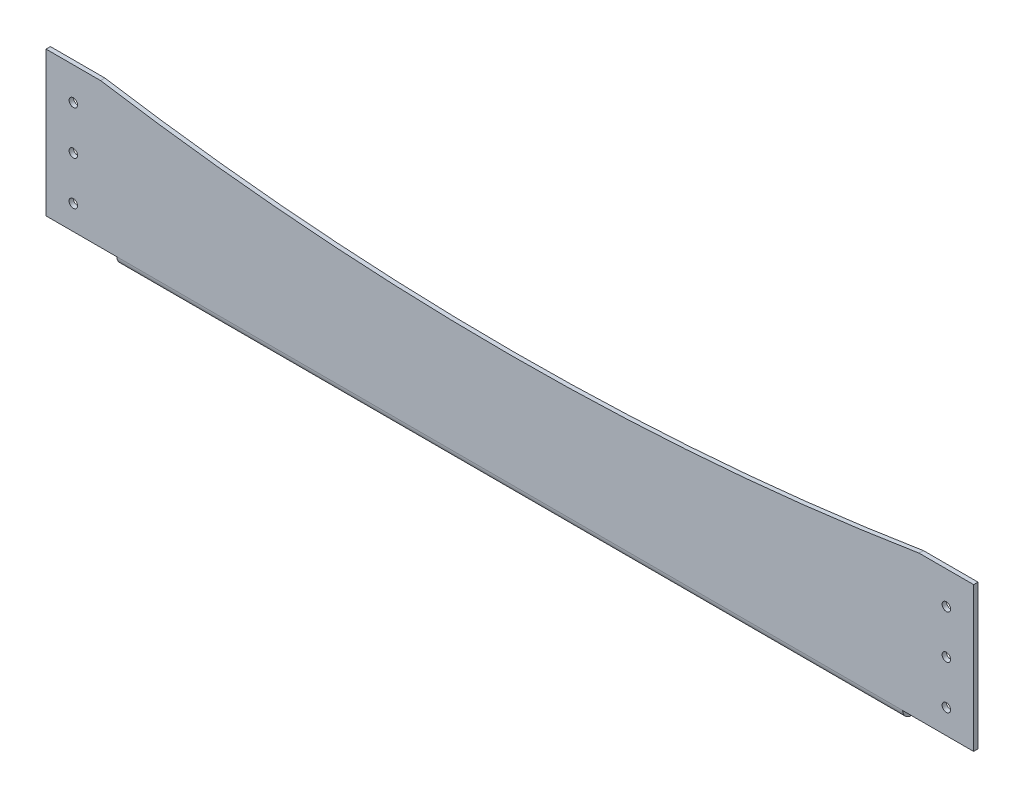
ISO-10303-21;
HEADER;
FILE_DESCRIPTION(('STEP AP214'),'2;1');
FILE_NAME('part.step','',(''),(''),'','','');
FILE_SCHEMA(('AUTOMOTIVE_DESIGN { 1 0 10303 214 1 1 1 1 }'));
ENDSEC;
DATA;
#1=APPLICATION_CONTEXT('core data for automotive mechanical design processes');
#2=APPLICATION_PROTOCOL_DEFINITION('international standard','automotive_design',2000,#1);
#3=PRODUCT_CONTEXT('',#1,'mechanical');
#4=PRODUCT('Part','Part','',(#3));
#5=PRODUCT_RELATED_PRODUCT_CATEGORY('part','',(#4));
#6=PRODUCT_DEFINITION_FORMATION('','',#4);
#7=PRODUCT_DEFINITION_CONTEXT('part definition',#1,'design');
#8=PRODUCT_DEFINITION('design','',#6,#7);
#9=PRODUCT_DEFINITION_SHAPE('','',#8);
#10=(LENGTH_UNIT() NAMED_UNIT(*) SI_UNIT(.MILLI.,.METRE.));
#11=(NAMED_UNIT(*) PLANE_ANGLE_UNIT() SI_UNIT($,.RADIAN.));
#12=(NAMED_UNIT(*) SI_UNIT($,.STERADIAN.) SOLID_ANGLE_UNIT());
#13=UNCERTAINTY_MEASURE_WITH_UNIT(LENGTH_MEASURE(1.E-05),#10,'distance_accuracy_value','');
#14=(GEOMETRIC_REPRESENTATION_CONTEXT(3) GLOBAL_UNCERTAINTY_ASSIGNED_CONTEXT((#13)) GLOBAL_UNIT_ASSIGNED_CONTEXT((#10,
#11,#12)) REPRESENTATION_CONTEXT('',''));
#15=CARTESIAN_POINT('',(0.,0.,0.));
#16=DIRECTION('',(0.,0.,1.));
#17=DIRECTION('',(1.,0.,0.));
#18=AXIS2_PLACEMENT_3D('',#15,#16,#17);
#19=CARTESIAN_POINT('',(269.874999999994,63.5,2.54));
#20=DIRECTION('',(0.,1.,0.));
#21=DIRECTION('',(-1.,0.,0.));
#22=AXIS2_PLACEMENT_3D('',#19,#20,#21);
#23=PLANE('',#22);
#24=DIRECTION('',(-1.,0.,0.));
#25=VECTOR('',#24,1.);
#26=CARTESIAN_POINT('',(269.874999999994,63.5,2.54));
#27=LINE('',#26,#25);
#28=CARTESIAN_POINT('',(-238.125000000007,63.4999999999999,2.54));
#29=VERTEX_POINT('',#28);
#30=CARTESIAN_POINT('',(-269.874999999993,63.5,2.54));
#31=VERTEX_POINT('',#30);
#32=EDGE_CURVE('E173',#29,#31,#27,.T.);
#33=ORIENTED_EDGE('',*,*,#32,.F.);
#34=DIRECTION('',(0.,0.,-1.));
#35=VECTOR('',#34,1.);
#36=CARTESIAN_POINT('',(-238.125000000007,63.4999999999999,0.));
#37=LINE('',#36,#35);
#38=CARTESIAN_POINT('',(-238.125000000007,63.4999999999999,0.));
#39=VERTEX_POINT('',#38);
#40=EDGE_CURVE('E153',#39,#29,#37,.F.);
#41=ORIENTED_EDGE('',*,*,#40,.F.);
#42=DIRECTION('',(1.,0.,0.));
#43=VECTOR('',#42,1.);
#44=CARTESIAN_POINT('',(0.,63.5,0.));
#45=LINE('',#44,#43);
#46=CARTESIAN_POINT('',(-269.874999999993,63.5,0.));
#47=VERTEX_POINT('',#46);
#48=EDGE_CURVE('E188',#39,#47,#45,.F.);
#49=ORIENTED_EDGE('',*,*,#48,.T.);
#50=DIRECTION('',(0.,0.,1.));
#51=VECTOR('',#50,1.);
#52=CARTESIAN_POINT('',(-269.874999999993,63.5,2.54));
#53=LINE('',#52,#51);
#54=EDGE_CURVE('E175',#47,#31,#53,.T.);
#55=ORIENTED_EDGE('',*,*,#54,.T.);
#56=EDGE_LOOP('',(#33,#41,#49,#55));
#57=FACE_BOUND('',#56,.T.);
#58=ADVANCED_FACE('F61',(#57),#23,.T.);
#59=CARTESIAN_POINT('',(269.874999999994,63.5,0.));
#60=VERTEX_POINT('',#59);
#61=CARTESIAN_POINT('',(238.125000000007,63.5,0.));
#62=VERTEX_POINT('',#61);
#63=EDGE_CURVE('E165',#60,#62,#45,.F.);
#64=ORIENTED_EDGE('',*,*,#63,.T.);
#65=DIRECTION('',(0.,0.,-1.));
#66=VECTOR('',#65,1.);
#67=CARTESIAN_POINT('',(238.125000000006,63.5,0.));
#68=LINE('',#67,#66);
#69=CARTESIAN_POINT('',(238.125000000007,63.4999999999999,2.54));
#70=VERTEX_POINT('',#69);
#71=EDGE_CURVE('E78',#62,#70,#68,.F.);
#72=ORIENTED_EDGE('',*,*,#71,.T.);
#73=CARTESIAN_POINT('',(269.874999999994,63.5,2.54));
#74=VERTEX_POINT('',#73);
#75=EDGE_CURVE('E163',#74,#70,#27,.T.);
#76=ORIENTED_EDGE('',*,*,#75,.F.);
#77=DIRECTION('',(0.,0.,1.));
#78=VECTOR('',#77,1.);
#79=CARTESIAN_POINT('',(269.874999999994,63.5,2.54));
#80=LINE('',#79,#78);
#81=EDGE_CURVE('E70',#60,#74,#80,.T.);
#82=ORIENTED_EDGE('',*,*,#81,.F.);
#83=EDGE_LOOP('',(#64,#72,#76,#82));
#84=FACE_BOUND('',#83,.T.);
#85=ADVANCED_FACE('F162',(#84),#23,.T.);
#86=CARTESIAN_POINT('',(0.,0.,2.54));
#87=DIRECTION('',(0.,0.,1.));
#88=DIRECTION('',(1.,0.,0.));
#89=AXIS2_PLACEMENT_3D('',#86,#87,#88);
#90=PLANE('',#89);
#91=CARTESIAN_POINT('',(-254.000000000006,44.4499999999999,2.54));
#92=DIRECTION('',(0.,0.,1.));
#93=DIRECTION('',(1.,0.,0.));
#94=AXIS2_PLACEMENT_3D('',#91,#92,#93);
#95=CIRCLE('',#94,2.45744999999997);
#96=CARTESIAN_POINT('',(-251.542550000006,44.4499999999999,2.54));
#97=VERTEX_POINT('',#96);
#98=EDGE_CURVE('E221',#97,#97,#95,.T.);
#99=ORIENTED_EDGE('',*,*,#98,.F.);
#100=EDGE_LOOP('',(#99));
#101=FACE_BOUND('',#100,.T.);
#102=CARTESIAN_POINT('',(-254.000000000006,19.0499999999999,2.54));
#103=DIRECTION('',(0.,0.,1.));
#104=DIRECTION('',(1.,0.,0.));
#105=AXIS2_PLACEMENT_3D('',#102,#103,#104);
#106=CIRCLE('',#105,2.45744999999997);
#107=CARTESIAN_POINT('',(-251.542550000006,19.0499999999999,2.54));
#108=VERTEX_POINT('',#107);
#109=EDGE_CURVE('E210',#108,#108,#106,.T.);
#110=ORIENTED_EDGE('',*,*,#109,.F.);
#111=EDGE_LOOP('',(#110));
#112=FACE_BOUND('',#111,.T.);
#113=CARTESIAN_POINT('',(-254.000000000006,-6.35000000000008,2.54));
#114=DIRECTION('',(0.,0.,1.));
#115=DIRECTION('',(1.,0.,0.));
#116=AXIS2_PLACEMENT_3D('',#113,#114,#115);
#117=CIRCLE('',#116,2.45744999999997);
#118=CARTESIAN_POINT('',(-251.542550000006,-6.35000000000008,2.54));
#119=VERTEX_POINT('',#118);
#120=EDGE_CURVE('E209',#119,#119,#117,.T.);
#121=ORIENTED_EDGE('',*,*,#120,.F.);
#122=EDGE_LOOP('',(#121));
#123=FACE_BOUND('',#122,.T.);
#124=CARTESIAN_POINT('',(253.999999999994,-6.35000000000008,2.54));
#125=DIRECTION('',(0.,0.,1.));
#126=DIRECTION('',(1.,0.,0.));
#127=AXIS2_PLACEMENT_3D('',#124,#125,#126);
#128=CIRCLE('',#127,2.45744999999997);
#129=CARTESIAN_POINT('',(256.457449999994,-6.35000000000008,2.54));
#130=VERTEX_POINT('',#129);
#131=EDGE_CURVE('E206',#130,#130,#128,.T.);
#132=ORIENTED_EDGE('',*,*,#131,.F.);
#133=EDGE_LOOP('',(#132));
#134=FACE_BOUND('',#133,.T.);
#135=CARTESIAN_POINT('',(253.999999999994,19.0499999999999,2.54));
#136=DIRECTION('',(0.,0.,1.));
#137=DIRECTION('',(1.,0.,0.));
#138=AXIS2_PLACEMENT_3D('',#135,#136,#137);
#139=CIRCLE('',#138,2.45744999999997);
#140=CARTESIAN_POINT('',(256.457449999994,19.0499999999999,2.54));
#141=VERTEX_POINT('',#140);
#142=EDGE_CURVE('E203',#141,#141,#139,.T.);
#143=ORIENTED_EDGE('',*,*,#142,.F.);
#144=EDGE_LOOP('',(#143));
#145=FACE_BOUND('',#144,.T.);
#146=CARTESIAN_POINT('',(253.999999999994,44.4499999999999,2.54));
#147=DIRECTION('',(0.,0.,1.));
#148=DIRECTION('',(1.,0.,0.));
#149=AXIS2_PLACEMENT_3D('',#146,#147,#148);
#150=CIRCLE('',#149,2.45744999999997);
#151=CARTESIAN_POINT('',(256.457449999994,44.4499999999999,2.54));
#152=VERTEX_POINT('',#151);
#153=EDGE_CURVE('E202',#152,#152,#150,.T.);
#154=ORIENTED_EDGE('',*,*,#153,.F.);
#155=EDGE_LOOP('',(#154));
#156=FACE_BOUND('',#155,.T.);
#157=ORIENTED_EDGE('',*,*,#75,.T.);
#158=CARTESIAN_POINT('',(0.,1542.25625000008,2.54));
#159=DIRECTION('',(0.,0.,1.));
#160=DIRECTION('',(1.,0.,0.));
#161=AXIS2_PLACEMENT_3D('',#158,#159,#160);
#162=CIRCLE('',#161,1497.80625000008);
#163=EDGE_CURVE('E150',#29,#70,#162,.T.);
#164=ORIENTED_EDGE('',*,*,#163,.F.);
#165=ORIENTED_EDGE('',*,*,#32,.T.);
#166=DIRECTION('',(0.,-1.,0.));
#167=VECTOR('',#166,1.);
#168=CARTESIAN_POINT('',(-269.874999999994,-20.5695654790461,2.54));
#169=LINE('',#168,#167);
#170=CARTESIAN_POINT('',(-269.874999999994,-20.5695654790461,2.54));
#171=VERTEX_POINT('',#170);
#172=EDGE_CURVE('E187',#31,#171,#169,.T.);
#173=ORIENTED_EDGE('',*,*,#172,.T.);
#174=DIRECTION('',(1.,0.,0.));
#175=VECTOR('',#174,1.);
#176=CARTESIAN_POINT('',(269.874999999994,-20.5695654790461,2.54));
#177=LINE('',#176,#175);
#178=CARTESIAN_POINT('',(-228.6,-20.5695654790461,2.54));
#179=VERTEX_POINT('',#178);
#180=EDGE_CURVE('E288',#171,#179,#177,.T.);
#181=ORIENTED_EDGE('',*,*,#180,.T.);
#182=DIRECTION('',(-1.,0.,0.));
#183=VECTOR('',#182,1.);
#184=CARTESIAN_POINT('',(-228.6,-20.5695654790461,2.54000000000006));
#185=LINE('',#184,#183);
#186=CARTESIAN_POINT('',(228.6,-20.5695654790461,2.5400000000001));
#187=VERTEX_POINT('',#186);
#188=EDGE_CURVE('E267',#179,#187,#185,.F.);
#189=ORIENTED_EDGE('',*,*,#188,.T.);
#190=CARTESIAN_POINT('',(269.874999999994,-20.5695654790461,2.54));
#191=VERTEX_POINT('',#190);
#192=EDGE_CURVE('E287',#187,#191,#177,.T.);
#193=ORIENTED_EDGE('',*,*,#192,.T.);
#194=DIRECTION('',(0.,1.,0.));
#195=VECTOR('',#194,1.);
#196=CARTESIAN_POINT('',(269.874999999994,-20.5695654790461,2.54));
#197=LINE('',#196,#195);
#198=EDGE_CURVE('E171',#191,#74,#197,.T.);
#199=ORIENTED_EDGE('',*,*,#198,.T.);
#200=EDGE_LOOP('',(#157,#164,#165,#173,#181,#189,#193,#199));
#201=FACE_BOUND('',#200,.T.);
#202=ADVANCED_FACE('F169',(#101,#112,#123,#134,#145,#156,#201),#90,.T.);
#203=CARTESIAN_POINT('',(0.,0.,0.));
#204=DIRECTION('',(0.,0.,1.));
#205=DIRECTION('',(1.,0.,0.));
#206=AXIS2_PLACEMENT_3D('',#203,#204,#205);
#207=PLANE('',#206);
#208=CARTESIAN_POINT('',(-254.000000000006,44.4499999999999,0.));
#209=DIRECTION('',(0.,0.,1.));
#210=DIRECTION('',(1.,0.,0.));
#211=AXIS2_PLACEMENT_3D('',#208,#209,#210);
#212=CIRCLE('',#211,2.45744999999997);
#213=CARTESIAN_POINT('',(-251.542550000006,44.4499999999999,0.));
#214=VERTEX_POINT('',#213);
#215=EDGE_CURVE('E65',#214,#214,#212,.T.);
#216=ORIENTED_EDGE('',*,*,#215,.T.);
#217=EDGE_LOOP('',(#216));
#218=FACE_BOUND('',#217,.T.);
#219=CARTESIAN_POINT('',(-254.000000000006,19.0499999999999,0.));
#220=DIRECTION('',(0.,0.,1.));
#221=DIRECTION('',(1.,0.,0.));
#222=AXIS2_PLACEMENT_3D('',#219,#220,#221);
#223=CIRCLE('',#222,2.45744999999997);
#224=CARTESIAN_POINT('',(-251.542550000006,19.0499999999999,0.));
#225=VERTEX_POINT('',#224);
#226=EDGE_CURVE('E207',#225,#225,#223,.T.);
#227=ORIENTED_EDGE('',*,*,#226,.T.);
#228=EDGE_LOOP('',(#227));
#229=FACE_BOUND('',#228,.T.);
#230=CARTESIAN_POINT('',(-254.000000000006,-6.35000000000008,0.));
#231=DIRECTION('',(0.,0.,1.));
#232=DIRECTION('',(1.,0.,0.));
#233=AXIS2_PLACEMENT_3D('',#230,#231,#232);
#234=CIRCLE('',#233,2.45744999999997);
#235=CARTESIAN_POINT('',(-251.542550000006,-6.35000000000008,0.));
#236=VERTEX_POINT('',#235);
#237=EDGE_CURVE('E214',#236,#236,#234,.T.);
#238=ORIENTED_EDGE('',*,*,#237,.T.);
#239=EDGE_LOOP('',(#238));
#240=FACE_BOUND('',#239,.T.);
#241=CARTESIAN_POINT('',(253.999999999994,-6.35000000000008,0.));
#242=DIRECTION('',(0.,0.,1.));
#243=DIRECTION('',(1.,0.,0.));
#244=AXIS2_PLACEMENT_3D('',#241,#242,#243);
#245=CIRCLE('',#244,2.45744999999997);
#246=CARTESIAN_POINT('',(256.457449999994,-6.35000000000008,0.));
#247=VERTEX_POINT('',#246);
#248=EDGE_CURVE('E204',#247,#247,#245,.T.);
#249=ORIENTED_EDGE('',*,*,#248,.T.);
#250=EDGE_LOOP('',(#249));
#251=FACE_BOUND('',#250,.T.);
#252=CARTESIAN_POINT('',(253.999999999994,19.0499999999999,0.));
#253=DIRECTION('',(0.,0.,1.));
#254=DIRECTION('',(1.,0.,0.));
#255=AXIS2_PLACEMENT_3D('',#252,#253,#254);
#256=CIRCLE('',#255,2.45744999999997);
#257=CARTESIAN_POINT('',(256.457449999994,19.0499999999999,0.));
#258=VERTEX_POINT('',#257);
#259=EDGE_CURVE('E199',#258,#258,#256,.T.);
#260=ORIENTED_EDGE('',*,*,#259,.T.);
#261=EDGE_LOOP('',(#260));
#262=FACE_BOUND('',#261,.T.);
#263=CARTESIAN_POINT('',(253.999999999994,44.4499999999999,0.));
#264=DIRECTION('',(0.,0.,1.));
#265=DIRECTION('',(1.,0.,0.));
#266=AXIS2_PLACEMENT_3D('',#263,#264,#265);
#267=CIRCLE('',#266,2.45744999999997);
#268=CARTESIAN_POINT('',(256.457449999994,44.4499999999999,0.));
#269=VERTEX_POINT('',#268);
#270=EDGE_CURVE('E232',#269,#269,#267,.T.);
#271=ORIENTED_EDGE('',*,*,#270,.T.);
#272=EDGE_LOOP('',(#271));
#273=FACE_BOUND('',#272,.T.);
#274=CARTESIAN_POINT('',(0.,1542.25625000008,0.));
#275=DIRECTION('',(0.,0.,1.));
#276=DIRECTION('',(1.,0.,0.));
#277=AXIS2_PLACEMENT_3D('',#274,#275,#276);
#278=CIRCLE('',#277,1497.80625000008);
#279=EDGE_CURVE('E157',#39,#62,#278,.T.);
#280=ORIENTED_EDGE('',*,*,#279,.T.);
#281=ORIENTED_EDGE('',*,*,#63,.F.);
#282=DIRECTION('',(0.,1.,0.));
#283=VECTOR('',#282,1.);
#284=CARTESIAN_POINT('',(269.874999999994,0.,0.));
#285=LINE('',#284,#283);
#286=CARTESIAN_POINT('',(269.874999999994,-20.5695654790461,0.));
#287=VERTEX_POINT('',#286);
#288=EDGE_CURVE('E189',#287,#60,#285,.T.);
#289=ORIENTED_EDGE('',*,*,#288,.F.);
#290=DIRECTION('',(1.,0.,0.));
#291=VECTOR('',#290,1.);
#292=CARTESIAN_POINT('',(0.,-20.5695654790461,0.));
#293=LINE('',#292,#291);
#294=CARTESIAN_POINT('',(228.6,-20.5695654790461,1.0321604682062E-13));
#295=VERTEX_POINT('',#294);
#296=EDGE_CURVE('E183',#295,#287,#293,.T.);
#297=ORIENTED_EDGE('',*,*,#296,.F.);
#298=DIRECTION('',(-1.,0.,0.));
#299=VECTOR('',#298,1.);
#300=CARTESIAN_POINT('',(-228.6,-20.5695654790461,0.));
#301=LINE('',#300,#299);
#302=CARTESIAN_POINT('',(-228.6,-20.5695654790461,0.));
#303=VERTEX_POINT('',#302);
#304=EDGE_CURVE('E278',#303,#295,#301,.F.);
#305=ORIENTED_EDGE('',*,*,#304,.F.);
#306=CARTESIAN_POINT('',(-269.874999999994,-20.5695654790461,0.));
#307=VERTEX_POINT('',#306);
#308=EDGE_CURVE('E193',#307,#303,#293,.T.);
#309=ORIENTED_EDGE('',*,*,#308,.F.);
#310=DIRECTION('',(0.,1.,0.));
#311=VECTOR('',#310,1.);
#312=CARTESIAN_POINT('',(-269.874999999993,0.,0.));
#313=LINE('',#312,#311);
#314=EDGE_CURVE('E180',#47,#307,#313,.F.);
#315=ORIENTED_EDGE('',*,*,#314,.F.);
#316=ORIENTED_EDGE('',*,*,#48,.F.);
#317=EDGE_LOOP('',(#280,#281,#289,#297,#305,#309,#315,#316));
#318=FACE_BOUND('',#317,.T.);
#319=ADVANCED_FACE('F300',(#218,#229,#240,#251,#262,#273,#318),#207,.F.);
#320=CARTESIAN_POINT('',(269.874999999994,-20.5695654790461,2.54));
#321=DIRECTION('',(0.,-1.,0.));
#322=DIRECTION('',(1.,0.,0.));
#323=AXIS2_PLACEMENT_3D('',#320,#321,#322);
#324=PLANE('',#323);
#325=ORIENTED_EDGE('',*,*,#308,.T.);
#326=DIRECTION('',(0.,0.,1.));
#327=VECTOR('',#326,1.);
#328=CARTESIAN_POINT('',(-228.6,-20.5695654790461,0.));
#329=LINE('',#328,#327);
#330=EDGE_CURVE('E273',#303,#179,#329,.T.);
#331=ORIENTED_EDGE('',*,*,#330,.T.);
#332=ORIENTED_EDGE('',*,*,#180,.F.);
#333=DIRECTION('',(0.,0.,1.));
#334=VECTOR('',#333,1.);
#335=CARTESIAN_POINT('',(-269.874999999994,-20.5695654790461,2.54));
#336=LINE('',#335,#334);
#337=EDGE_CURVE('E172',#307,#171,#336,.T.);
#338=ORIENTED_EDGE('',*,*,#337,.F.);
#339=EDGE_LOOP('',(#325,#331,#332,#338));
#340=FACE_BOUND('',#339,.T.);
#341=ADVANCED_FACE('F308',(#340),#324,.T.);
#342=CARTESIAN_POINT('',(269.874999999994,-20.5695654790461,2.54));
#343=DIRECTION('',(1.,0.,0.));
#344=DIRECTION('',(0.,1.,0.));
#345=AXIS2_PLACEMENT_3D('',#342,#343,#344);
#346=PLANE('',#345);
#347=DIRECTION('',(0.,0.,1.));
#348=VECTOR('',#347,1.);
#349=CARTESIAN_POINT('',(269.874999999994,-20.5695654790461,2.54));
#350=LINE('',#349,#348);
#351=EDGE_CURVE('E13',#287,#191,#350,.T.);
#352=ORIENTED_EDGE('',*,*,#351,.F.);
#353=ORIENTED_EDGE('',*,*,#288,.T.);
#354=ORIENTED_EDGE('',*,*,#81,.T.);
#355=ORIENTED_EDGE('',*,*,#198,.F.);
#356=EDGE_LOOP('',(#352,#353,#354,#355));
#357=FACE_BOUND('',#356,.T.);
#358=ADVANCED_FACE('F298',(#357),#346,.T.);
#359=CARTESIAN_POINT('',(-269.874999999994,-20.5695654790461,2.54));
#360=DIRECTION('',(-1.,0.,0.));
#361=DIRECTION('',(0.,-1.,0.));
#362=AXIS2_PLACEMENT_3D('',#359,#360,#361);
#363=PLANE('',#362);
#364=ORIENTED_EDGE('',*,*,#54,.F.);
#365=ORIENTED_EDGE('',*,*,#314,.T.);
#366=ORIENTED_EDGE('',*,*,#337,.T.);
#367=ORIENTED_EDGE('',*,*,#172,.F.);
#368=EDGE_LOOP('',(#364,#365,#366,#367));
#369=FACE_BOUND('',#368,.T.);
#370=ADVANCED_FACE('F318',(#369),#363,.T.);
#371=DIRECTION('',(0.,0.,1.));
#372=VECTOR('',#371,1.);
#373=CARTESIAN_POINT('',(228.6,-20.5695654790461,1.0321604682062E-13));
#374=LINE('',#373,#372);
#375=EDGE_CURVE('E184',#295,#187,#374,.T.);
#376=ORIENTED_EDGE('',*,*,#375,.F.);
#377=ORIENTED_EDGE('',*,*,#296,.T.);
#378=ORIENTED_EDGE('',*,*,#351,.T.);
#379=ORIENTED_EDGE('',*,*,#192,.F.);
#380=EDGE_LOOP('',(#376,#377,#378,#379));
#381=FACE_BOUND('',#380,.T.);
#382=ADVANCED_FACE('F63',(#381),#324,.T.);
#383=CARTESIAN_POINT('',(228.6,-20.5695654790461,-2.5399999999999));
#384=DIRECTION('',(1.,0.,0.));
#385=DIRECTION('',(0.,0.,-1.));
#386=AXIS2_PLACEMENT_3D('',#383,#384,#385);
#387=PLANE('',#386);
#388=DIRECTION('',(0.,-0.996194698091745,0.0871557427476696));
#389=VECTOR('',#388,1.);
#390=CARTESIAN_POINT('',(228.6,-25.6302345453521,-2.09724882684175));
#391=LINE('',#390,#389);
#392=CARTESIAN_POINT('',(228.6,-23.0999000121991,-2.31862441342081));
#393=VERTEX_POINT('',#392);
#394=CARTESIAN_POINT('',(228.6,-25.6302345453521,-2.09724882684173));
#395=VERTEX_POINT('',#394);
#396=EDGE_CURVE('E166',#393,#395,#391,.T.);
#397=ORIENTED_EDGE('',*,*,#396,.F.);
#398=CARTESIAN_POINT('',(228.6,-20.5695654790461,-2.5399999999999));
#399=DIRECTION('',(-1.,0.,0.));
#400=DIRECTION('',(0.,0.,1.));
#401=AXIS2_PLACEMENT_3D('',#398,#399,#400);
#402=CIRCLE('',#401,2.54);
#403=EDGE_CURVE('E275',#295,#393,#402,.F.);
#404=ORIENTED_EDGE('',*,*,#403,.F.);
#405=ORIENTED_EDGE('',*,*,#375,.T.);
#406=CARTESIAN_POINT('',(228.6,-20.5695654790461,-2.5399999999999));
#407=DIRECTION('',(-1.,0.,0.));
#408=DIRECTION('',(0.,0.,1.));
#409=AXIS2_PLACEMENT_3D('',#406,#407,#408);
#410=CIRCLE('',#409,5.08);
#411=EDGE_CURVE('E270',#187,#395,#410,.F.);
#412=ORIENTED_EDGE('',*,*,#411,.T.);
#413=EDGE_LOOP('',(#397,#404,#405,#412));
#414=FACE_BOUND('',#413,.T.);
#415=ADVANCED_FACE('F325',(#414),#387,.T.);
#416=CARTESIAN_POINT('',(-228.6,-20.5695654790461,-2.53999999999993));
#417=DIRECTION('',(1.,0.,0.));
#418=DIRECTION('',(0.,0.,-1.));
#419=AXIS2_PLACEMENT_3D('',#416,#417,#418);
#420=PLANE('',#419);
#421=CARTESIAN_POINT('',(-228.6,-20.5695654790461,-2.53999999999993));
#422=DIRECTION('',(-1.,0.,0.));
#423=DIRECTION('',(0.,0.,1.));
#424=AXIS2_PLACEMENT_3D('',#421,#422,#423);
#425=CIRCLE('',#424,2.54);
#426=CARTESIAN_POINT('',(-228.6,-23.0999000121991,-2.31862441342085));
#427=VERTEX_POINT('',#426);
#428=EDGE_CURVE('E239',#427,#303,#425,.T.);
#429=ORIENTED_EDGE('',*,*,#428,.F.);
#430=DIRECTION('',(0.,-0.996194698091745,0.0871557427476696));
#431=VECTOR('',#430,1.);
#432=CARTESIAN_POINT('',(-228.6,-23.0999000121991,-2.31862441342084));
#433=LINE('',#432,#431);
#434=CARTESIAN_POINT('',(-228.6,-25.6302345453521,-2.09724882684176));
#435=VERTEX_POINT('',#434);
#436=EDGE_CURVE('E261',#427,#435,#433,.T.);
#437=ORIENTED_EDGE('',*,*,#436,.T.);
#438=CARTESIAN_POINT('',(-228.6,-20.5695654790461,-2.53999999999993));
#439=DIRECTION('',(-1.,0.,0.));
#440=DIRECTION('',(0.,0.,1.));
#441=AXIS2_PLACEMENT_3D('',#438,#439,#440);
#442=CIRCLE('',#441,5.08);
#443=EDGE_CURVE('E86',#435,#179,#442,.T.);
#444=ORIENTED_EDGE('',*,*,#443,.T.);
#445=ORIENTED_EDGE('',*,*,#330,.F.);
#446=EDGE_LOOP('',(#429,#437,#444,#445));
#447=FACE_BOUND('',#446,.T.);
#448=ADVANCED_FACE('F311',(#447),#420,.F.);
#449=CARTESIAN_POINT('',(-228.6,-20.5695654790461,-2.53999999999993));
#450=DIRECTION('',(-1.,0.,0.));
#451=DIRECTION('',(0.,-0.996194698091745,0.0871557427476697));
#452=AXIS2_PLACEMENT_3D('',#449,#450,#451);
#453=CYLINDRICAL_SURFACE('',#452,5.08);
#454=ORIENTED_EDGE('',*,*,#188,.F.);
#455=ORIENTED_EDGE('',*,*,#443,.F.);
#456=DIRECTION('',(-1.,0.,0.));
#457=VECTOR('',#456,1.);
#458=CARTESIAN_POINT('',(228.6,-25.6302345453521,-2.09724882684175));
#459=LINE('',#458,#457);
#460=EDGE_CURVE('E259',#435,#395,#459,.F.);
#461=ORIENTED_EDGE('',*,*,#460,.T.);
#462=ORIENTED_EDGE('',*,*,#411,.F.);
#463=EDGE_LOOP('',(#454,#455,#461,#462));
#464=FACE_BOUND('',#463,.T.);
#465=ADVANCED_FACE('F346',(#464),#453,.T.);
#466=CARTESIAN_POINT('',(-228.6,-20.5695654790461,-2.53999999999993));
#467=DIRECTION('',(-1.,0.,0.));
#468=DIRECTION('',(0.,-0.996194698091745,0.0871557427476697));
#469=AXIS2_PLACEMENT_3D('',#466,#467,#468);
#470=CYLINDRICAL_SURFACE('',#469,2.54);
#471=ORIENTED_EDGE('',*,*,#304,.T.);
#472=ORIENTED_EDGE('',*,*,#403,.T.);
#473=DIRECTION('',(-1.,0.,0.));
#474=VECTOR('',#473,1.);
#475=CARTESIAN_POINT('',(228.6,-23.0999000121991,-2.31862441342083));
#476=LINE('',#475,#474);
#477=EDGE_CURVE('E263',#393,#427,#476,.T.);
#478=ORIENTED_EDGE('',*,*,#477,.T.);
#479=ORIENTED_EDGE('',*,*,#428,.T.);
#480=EDGE_LOOP('',(#471,#472,#478,#479));
#481=FACE_BOUND('',#480,.T.);
#482=ADVANCED_FACE('F315',(#481),#470,.F.);
#483=CARTESIAN_POINT('',(228.6,-25.4273811942033,0.221375586579172));
#484=DIRECTION('',(1.,0.,0.));
#485=DIRECTION('',(0.,0.,-1.));
#486=AXIS2_PLACEMENT_3D('',#483,#484,#485);
#487=PLANE('',#486);
#488=DIRECTION('',(0.,-0.0871557427476697,-0.996194698091745));
#489=VECTOR('',#488,1.);
#490=CARTESIAN_POINT('',(228.6,-22.7407977014556,1.78593378041898));
#491=LINE('',#490,#489);
#492=CARTESIAN_POINT('',(228.6,-24.9079491756923,-22.9847209181094));
#493=VERTEX_POINT('',#492);
#494=EDGE_CURVE('E257',#393,#493,#491,.T.);
#495=ORIENTED_EDGE('',*,*,#494,.F.);
#496=ORIENTED_EDGE('',*,*,#396,.T.);
#497=DIRECTION('',(0.,0.0871557427476697,0.996194698091745));
#498=VECTOR('',#497,1.);
#499=CARTESIAN_POINT('',(228.6,-25.4273811942033,0.221375586579172));
#500=LINE('',#499,#498);
#501=CARTESIAN_POINT('',(228.6,-27.4382837088453,-22.7633453315303));
#502=VERTEX_POINT('',#501);
#503=EDGE_CURVE('E249',#395,#502,#500,.F.);
#504=ORIENTED_EDGE('',*,*,#503,.T.);
#505=DIRECTION('',(0.,0.996194698091745,-0.0871557427476698));
#506=VECTOR('',#505,1.);
#507=CARTESIAN_POINT('',(228.6,-27.4382837088453,-22.7633453315303));
#508=LINE('',#507,#506);
#509=EDGE_CURVE('E240',#502,#493,#508,.T.);
#510=ORIENTED_EDGE('',*,*,#509,.T.);
#511=EDGE_LOOP('',(#495,#496,#504,#510));
#512=FACE_BOUND('',#511,.T.);
#513=ADVANCED_FACE('F352',(#512),#487,.T.);
#514=CARTESIAN_POINT('',(-228.6,-27.4382837088453,-22.7633453315303));
#515=DIRECTION('',(-1.,0.,0.));
#516=DIRECTION('',(0.,0.,1.));
#517=AXIS2_PLACEMENT_3D('',#514,#515,#516);
#518=PLANE('',#517);
#519=DIRECTION('',(0.,-0.0871557427476697,-0.996194698091745));
#520=VECTOR('',#519,1.);
#521=CARTESIAN_POINT('',(-228.6,-27.4382837088453,-22.7633453315303));
#522=LINE('',#521,#520);
#523=CARTESIAN_POINT('',(-228.6,-27.4382837088453,-22.7633453315303));
#524=VERTEX_POINT('',#523);
#525=EDGE_CURVE('E243',#524,#435,#522,.F.);
#526=ORIENTED_EDGE('',*,*,#525,.T.);
#527=ORIENTED_EDGE('',*,*,#436,.F.);
#528=DIRECTION('',(0.,0.0871557427476697,0.996194698091745));
#529=VECTOR('',#528,1.);
#530=CARTESIAN_POINT('',(-228.6,-22.7407977014556,1.78593378041898));
#531=LINE('',#530,#529);
#532=CARTESIAN_POINT('',(-228.6,-24.9079491756923,-22.9847209181094));
#533=VERTEX_POINT('',#532);
#534=EDGE_CURVE('E251',#533,#427,#531,.T.);
#535=ORIENTED_EDGE('',*,*,#534,.F.);
#536=DIRECTION('',(0.,0.996194698091745,-0.0871557427476698));
#537=VECTOR('',#536,1.);
#538=CARTESIAN_POINT('',(-228.6,-27.4382837088453,-22.7633453315303));
#539=LINE('',#538,#537);
#540=EDGE_CURVE('E237',#524,#533,#539,.T.);
#541=ORIENTED_EDGE('',*,*,#540,.F.);
#542=EDGE_LOOP('',(#526,#527,#535,#541));
#543=FACE_BOUND('',#542,.T.);
#544=ADVANCED_FACE('F358',(#543),#518,.T.);
#545=CARTESIAN_POINT('',(0.,-25.2711322346087,2.00730936699779));
#546=DIRECTION('',(0.,0.996194698091745,-0.0871557427476697));
#547=DIRECTION('',(0.,0.0871557427476697,0.996194698091745));
#548=AXIS2_PLACEMENT_3D('',#545,#546,#547);
#549=PLANE('',#548);
#550=ORIENTED_EDGE('',*,*,#460,.F.);
#551=ORIENTED_EDGE('',*,*,#525,.F.);
#552=DIRECTION('',(1.,0.,0.));
#553=VECTOR('',#552,1.);
#554=CARTESIAN_POINT('',(228.6,-27.4382837088453,-22.7633453315303));
#555=LINE('',#554,#553);
#556=EDGE_CURVE('E246',#502,#524,#555,.F.);
#557=ORIENTED_EDGE('',*,*,#556,.F.);
#558=ORIENTED_EDGE('',*,*,#503,.F.);
#559=EDGE_LOOP('',(#550,#551,#557,#558));
#560=FACE_BOUND('',#559,.T.);
#561=ADVANCED_FACE('F367',(#560),#549,.F.);
#562=CARTESIAN_POINT('',(0.,-22.7407977014556,1.78593378041871));
#563=DIRECTION('',(0.,0.996194698091745,-0.0871557427476697));
#564=DIRECTION('',(0.,0.0871557427476697,0.996194698091745));
#565=AXIS2_PLACEMENT_3D('',#562,#563,#564);
#566=PLANE('',#565);
#567=ORIENTED_EDGE('',*,*,#534,.T.);
#568=ORIENTED_EDGE('',*,*,#477,.F.);
#569=ORIENTED_EDGE('',*,*,#494,.T.);
#570=DIRECTION('',(-1.,0.,0.));
#571=VECTOR('',#570,1.);
#572=CARTESIAN_POINT('',(0.,-24.9079491756923,-22.9847209181094));
#573=LINE('',#572,#571);
#574=EDGE_CURVE('E254',#493,#533,#573,.T.);
#575=ORIENTED_EDGE('',*,*,#574,.T.);
#576=EDGE_LOOP('',(#567,#568,#569,#575));
#577=FACE_BOUND('',#576,.T.);
#578=ADVANCED_FACE('F363',(#577),#566,.T.);
#579=CARTESIAN_POINT('',(228.6,-27.4382837088453,-22.7633453315303));
#580=DIRECTION('',(0.,-0.0871557427476697,-0.996194698091744));
#581=DIRECTION('',(0.,0.996194698091745,-0.0871557427476698));
#582=AXIS2_PLACEMENT_3D('',#579,#580,#581);
#583=PLANE('',#582);
#584=ORIENTED_EDGE('',*,*,#574,.F.);
#585=ORIENTED_EDGE('',*,*,#509,.F.);
#586=ORIENTED_EDGE('',*,*,#556,.T.);
#587=ORIENTED_EDGE('',*,*,#540,.T.);
#588=EDGE_LOOP('',(#584,#585,#586,#587));
#589=FACE_BOUND('',#588,.T.);
#590=ADVANCED_FACE('F360',(#589),#583,.T.);
#591=CARTESIAN_POINT('',(0.,1542.25625000008,0.));
#592=DIRECTION('',(0.,0.,1.));
#593=DIRECTION('',(1.,0.,0.));
#594=AXIS2_PLACEMENT_3D('',#591,#592,#593);
#595=CYLINDRICAL_SURFACE('',#594,1497.80625000008);
#596=ORIENTED_EDGE('',*,*,#71,.F.);
#597=ORIENTED_EDGE('',*,*,#279,.F.);
#598=ORIENTED_EDGE('',*,*,#40,.T.);
#599=ORIENTED_EDGE('',*,*,#163,.T.);
#600=EDGE_LOOP('',(#596,#597,#598,#599));
#601=FACE_BOUND('',#600,.T.);
#602=ADVANCED_FACE('F151',(#601),#595,.F.);
#603=CARTESIAN_POINT('',(253.999999999994,44.4499999999999,2.54));
#604=DIRECTION('',(0.,0.,1.));
#605=DIRECTION('',(1.,0.,0.));
#606=AXIS2_PLACEMENT_3D('',#603,#604,#605);
#607=CYLINDRICAL_SURFACE('',#606,2.45744999999997);
#608=ORIENTED_EDGE('',*,*,#153,.T.);
#609=EDGE_LOOP('',(#608));
#610=FACE_BOUND('',#609,.T.);
#611=ORIENTED_EDGE('',*,*,#270,.F.);
#612=EDGE_LOOP('',(#611));
#613=FACE_BOUND('',#612,.T.);
#614=ADVANCED_FACE('F377',(#610,#613),#607,.F.);
#615=CARTESIAN_POINT('',(253.999999999994,19.0499999999999,2.54));
#616=DIRECTION('',(0.,0.,1.));
#617=DIRECTION('',(1.,0.,0.));
#618=AXIS2_PLACEMENT_3D('',#615,#616,#617);
#619=CYLINDRICAL_SURFACE('',#618,2.45744999999997);
#620=ORIENTED_EDGE('',*,*,#142,.T.);
#621=EDGE_LOOP('',(#620));
#622=FACE_BOUND('',#621,.T.);
#623=ORIENTED_EDGE('',*,*,#259,.F.);
#624=EDGE_LOOP('',(#623));
#625=FACE_BOUND('',#624,.T.);
#626=ADVANCED_FACE('F380',(#622,#625),#619,.F.);
#627=CARTESIAN_POINT('',(253.999999999994,-6.35000000000008,2.54));
#628=DIRECTION('',(0.,0.,1.));
#629=DIRECTION('',(1.,0.,0.));
#630=AXIS2_PLACEMENT_3D('',#627,#628,#629);
#631=CYLINDRICAL_SURFACE('',#630,2.45744999999997);
#632=ORIENTED_EDGE('',*,*,#131,.T.);
#633=EDGE_LOOP('',(#632));
#634=FACE_BOUND('',#633,.T.);
#635=ORIENTED_EDGE('',*,*,#248,.F.);
#636=EDGE_LOOP('',(#635));
#637=FACE_BOUND('',#636,.T.);
#638=ADVANCED_FACE('F384',(#634,#637),#631,.F.);
#639=CARTESIAN_POINT('',(-254.000000000006,-6.35000000000008,2.54));
#640=DIRECTION('',(0.,0.,1.));
#641=DIRECTION('',(1.,0.,0.));
#642=AXIS2_PLACEMENT_3D('',#639,#640,#641);
#643=CYLINDRICAL_SURFACE('',#642,2.45744999999997);
#644=ORIENTED_EDGE('',*,*,#120,.T.);
#645=EDGE_LOOP('',(#644));
#646=FACE_BOUND('',#645,.T.);
#647=ORIENTED_EDGE('',*,*,#237,.F.);
#648=EDGE_LOOP('',(#647));
#649=FACE_BOUND('',#648,.T.);
#650=ADVANCED_FACE('F388',(#646,#649),#643,.F.);
#651=CARTESIAN_POINT('',(-254.000000000006,19.0499999999999,2.54));
#652=DIRECTION('',(0.,0.,1.));
#653=DIRECTION('',(1.,0.,0.));
#654=AXIS2_PLACEMENT_3D('',#651,#652,#653);
#655=CYLINDRICAL_SURFACE('',#654,2.45744999999997);
#656=ORIENTED_EDGE('',*,*,#109,.T.);
#657=EDGE_LOOP('',(#656));
#658=FACE_BOUND('',#657,.T.);
#659=ORIENTED_EDGE('',*,*,#226,.F.);
#660=EDGE_LOOP('',(#659));
#661=FACE_BOUND('',#660,.T.);
#662=ADVANCED_FACE('F392',(#658,#661),#655,.F.);
#663=CARTESIAN_POINT('',(-254.000000000006,44.4499999999999,2.54));
#664=DIRECTION('',(0.,0.,1.));
#665=DIRECTION('',(1.,0.,0.));
#666=AXIS2_PLACEMENT_3D('',#663,#664,#665);
#667=CYLINDRICAL_SURFACE('',#666,2.45744999999997);
#668=ORIENTED_EDGE('',*,*,#98,.T.);
#669=EDGE_LOOP('',(#668));
#670=FACE_BOUND('',#669,.T.);
#671=ORIENTED_EDGE('',*,*,#215,.F.);
#672=EDGE_LOOP('',(#671));
#673=FACE_BOUND('',#672,.T.);
#674=ADVANCED_FACE('F396',(#670,#673),#667,.F.);
#675=CLOSED_SHELL('',(#58,#85,#202,#319,#341,#358,#370,#382,#415,#448,#465,#482,#513,#544,#561,
#578,#590,#602,#614,#626,#638,#650,#662,#674));
#676=MANIFOLD_SOLID_BREP('B2',#675);
#677=ADVANCED_BREP_SHAPE_REPRESENTATION('',(#18,#676),#14);
#678=SHAPE_DEFINITION_REPRESENTATION(#9,#677);
ENDSEC;
END-ISO-10303-21;
